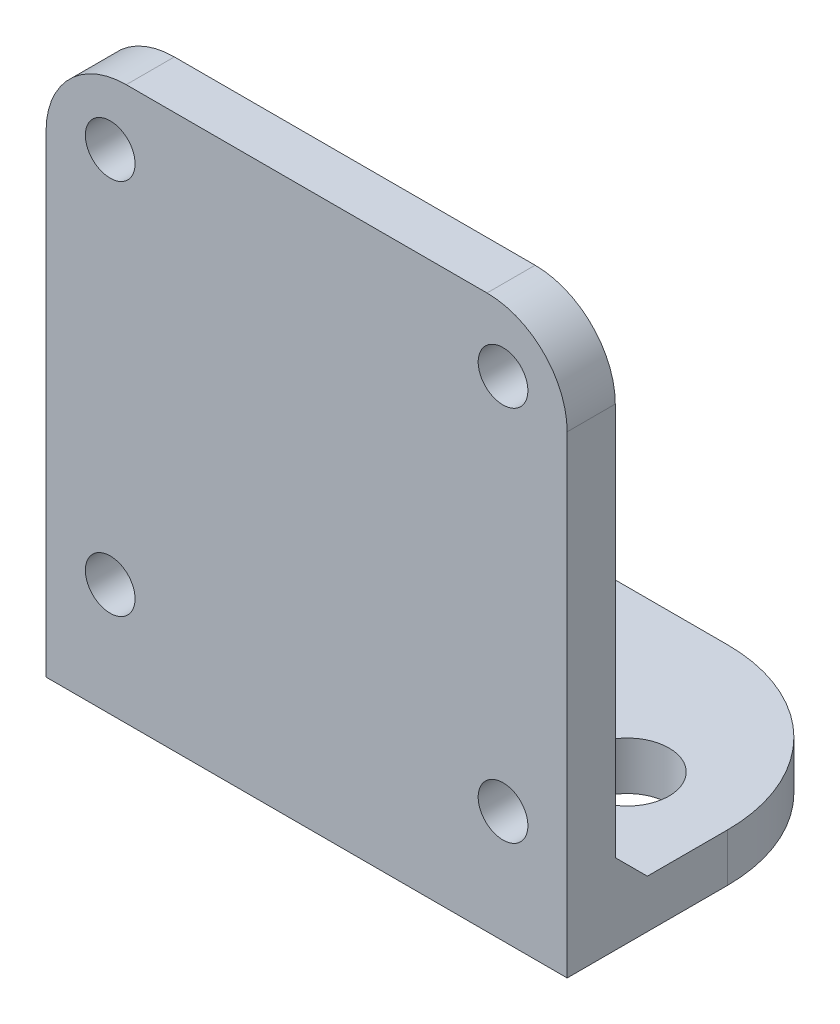
ISO-10303-21;
HEADER;
FILE_DESCRIPTION(('STEP AP214'),'2;1');
FILE_NAME('part.step','',(''),(''),'','','');
FILE_SCHEMA(('AUTOMOTIVE_DESIGN { 1 0 10303 214 1 1 1 1 }'));
ENDSEC;
DATA;
#1=APPLICATION_CONTEXT('core data for automotive mechanical design processes');
#2=APPLICATION_PROTOCOL_DEFINITION('international standard','automotive_design',2000,#1);
#3=PRODUCT_CONTEXT('',#1,'mechanical');
#4=PRODUCT('Part','Part','',(#3));
#5=PRODUCT_RELATED_PRODUCT_CATEGORY('part','',(#4));
#6=PRODUCT_DEFINITION_FORMATION('','',#4);
#7=PRODUCT_DEFINITION_CONTEXT('part definition',#1,'design');
#8=PRODUCT_DEFINITION('design','',#6,#7);
#9=PRODUCT_DEFINITION_SHAPE('','',#8);
#10=(LENGTH_UNIT() NAMED_UNIT(*) SI_UNIT(.MILLI.,.METRE.));
#11=(NAMED_UNIT(*) PLANE_ANGLE_UNIT() SI_UNIT($,.RADIAN.));
#12=(NAMED_UNIT(*) SI_UNIT($,.STERADIAN.) SOLID_ANGLE_UNIT());
#13=UNCERTAINTY_MEASURE_WITH_UNIT(LENGTH_MEASURE(1.E-05),#10,'distance_accuracy_value','');
#14=(GEOMETRIC_REPRESENTATION_CONTEXT(3) GLOBAL_UNCERTAINTY_ASSIGNED_CONTEXT((#13)) GLOBAL_UNIT_ASSIGNED_CONTEXT((#10,
#11,#12)) REPRESENTATION_CONTEXT('',''));
#15=CARTESIAN_POINT('',(0.,0.,0.));
#16=DIRECTION('',(0.,0.,1.));
#17=DIRECTION('',(1.,0.,0.));
#18=AXIS2_PLACEMENT_3D('',#15,#16,#17);
#19=CARTESIAN_POINT('',(0.,0.,3.));
#20=DIRECTION('',(0.,0.,-1.));
#21=DIRECTION('',(-1.,0.,0.));
#22=AXIS2_PLACEMENT_3D('',#19,#20,#21);
#23=PLANE('',#22);
#24=DIRECTION('',(0.,1.,0.));
#25=VECTOR('',#24,1.);
#26=CARTESIAN_POINT('',(28.5,-27.5,3.));
#27=LINE('',#26,#25);
#28=CARTESIAN_POINT('',(28.5,-30.5,3.));
#29=VERTEX_POINT('',#28);
#30=CARTESIAN_POINT('',(28.5,-1.,3.));
#31=VERTEX_POINT('',#30);
#32=EDGE_CURVE('E151',#29,#31,#27,.T.);
#33=ORIENTED_EDGE('',*,*,#32,.T.);
#34=CARTESIAN_POINT('',(23.5,-1.,3.));
#35=DIRECTION('',(0.,0.,-1.));
#36=DIRECTION('',(-1.,0.,0.));
#37=AXIS2_PLACEMENT_3D('',#34,#35,#36);
#38=CIRCLE('',#37,5.);
#39=CARTESIAN_POINT('',(23.5,4.,3.));
#40=VERTEX_POINT('',#39);
#41=EDGE_CURVE('E42',#31,#40,#38,.F.);
#42=ORIENTED_EDGE('',*,*,#41,.T.);
#43=DIRECTION('',(-1.,0.,0.));
#44=VECTOR('',#43,1.);
#45=CARTESIAN_POINT('',(-4.00000000000001,4.,3.));
#46=LINE('',#45,#44);
#47=CARTESIAN_POINT('',(0.999999999999997,4.,3.));
#48=VERTEX_POINT('',#47);
#49=EDGE_CURVE('E125',#40,#48,#46,.T.);
#50=ORIENTED_EDGE('',*,*,#49,.T.);
#51=CARTESIAN_POINT('',(0.999999999999997,-1.,3.));
#52=DIRECTION('',(0.,0.,-1.));
#53=DIRECTION('',(-1.,0.,0.));
#54=AXIS2_PLACEMENT_3D('',#51,#52,#53);
#55=CIRCLE('',#54,5.);
#56=CARTESIAN_POINT('',(-4.00000000000001,-1.,3.));
#57=VERTEX_POINT('',#56);
#58=EDGE_CURVE('E49',#48,#57,#55,.F.);
#59=ORIENTED_EDGE('',*,*,#58,.T.);
#60=DIRECTION('',(0.,-1.,0.));
#61=VECTOR('',#60,1.);
#62=CARTESIAN_POINT('',(-4.00000000000001,4.,3.));
#63=LINE('',#62,#61);
#64=CARTESIAN_POINT('',(-4.,-30.5,3.));
#65=VERTEX_POINT('',#64);
#66=EDGE_CURVE('E117',#57,#65,#63,.T.);
#67=ORIENTED_EDGE('',*,*,#66,.T.);
#68=DIRECTION('',(1.,0.,0.));
#69=VECTOR('',#68,1.);
#70=CARTESIAN_POINT('',(28.5,-30.5,3.));
#71=LINE('',#70,#69);
#72=EDGE_CURVE('E121',#65,#29,#71,.T.);
#73=ORIENTED_EDGE('',*,*,#72,.T.);
#74=EDGE_LOOP('',(#33,#42,#50,#59,#67,#73));
#75=FACE_BOUND('',#74,.T.);
#76=CARTESIAN_POINT('',(0.,0.,3.));
#77=DIRECTION('',(0.,0.,1.));
#78=DIRECTION('',(1.,0.,0.));
#79=AXIS2_PLACEMENT_3D('',#76,#77,#78);
#80=CIRCLE('',#79,1.55);
#81=CARTESIAN_POINT('',(1.55,0.,3.));
#82=VERTEX_POINT('',#81);
#83=EDGE_CURVE('E148',#82,#82,#80,.T.);
#84=ORIENTED_EDGE('',*,*,#83,.F.);
#85=EDGE_LOOP('',(#84));
#86=FACE_BOUND('',#85,.T.);
#87=CARTESIAN_POINT('',(24.5,0.,3.));
#88=DIRECTION('',(0.,0.,1.));
#89=DIRECTION('',(1.,0.,0.));
#90=AXIS2_PLACEMENT_3D('',#87,#88,#89);
#91=CIRCLE('',#90,1.55);
#92=CARTESIAN_POINT('',(26.05,0.,3.));
#93=VERTEX_POINT('',#92);
#94=EDGE_CURVE('E291',#93,#93,#91,.T.);
#95=ORIENTED_EDGE('',*,*,#94,.F.);
#96=EDGE_LOOP('',(#95));
#97=FACE_BOUND('',#96,.T.);
#98=CARTESIAN_POINT('',(0.,-23.5,3.));
#99=DIRECTION('',(0.,0.,1.));
#100=DIRECTION('',(1.,0.,0.));
#101=AXIS2_PLACEMENT_3D('',#98,#99,#100);
#102=CIRCLE('',#101,1.55);
#103=CARTESIAN_POINT('',(1.55,-23.5,3.));
#104=VERTEX_POINT('',#103);
#105=EDGE_CURVE('E285',#104,#104,#102,.T.);
#106=ORIENTED_EDGE('',*,*,#105,.F.);
#107=EDGE_LOOP('',(#106));
#108=FACE_BOUND('',#107,.T.);
#109=CARTESIAN_POINT('',(24.5,-23.5,3.));
#110=DIRECTION('',(0.,0.,1.));
#111=DIRECTION('',(1.,0.,0.));
#112=AXIS2_PLACEMENT_3D('',#109,#110,#111);
#113=CIRCLE('',#112,1.55);
#114=CARTESIAN_POINT('',(26.05,-23.5,3.));
#115=VERTEX_POINT('',#114);
#116=EDGE_CURVE('E279',#115,#115,#113,.T.);
#117=ORIENTED_EDGE('',*,*,#116,.F.);
#118=EDGE_LOOP('',(#117));
#119=FACE_BOUND('',#118,.T.);
#120=ADVANCED_FACE('F34',(#75,#86,#97,#108,#119),#23,.F.);
#121=CARTESIAN_POINT('',(0.,0.,0.));
#122=DIRECTION('',(0.,0.,-1.));
#123=DIRECTION('',(-1.,0.,0.));
#124=AXIS2_PLACEMENT_3D('',#121,#122,#123);
#125=PLANE('',#124);
#126=DIRECTION('',(-1.,0.,0.));
#127=VECTOR('',#126,1.);
#128=CARTESIAN_POINT('',(-4.00000000000001,4.,0.));
#129=LINE('',#128,#127);
#130=CARTESIAN_POINT('',(23.5,4.,0.));
#131=VERTEX_POINT('',#130);
#132=CARTESIAN_POINT('',(0.999999999999997,4.,0.));
#133=VERTEX_POINT('',#132);
#134=EDGE_CURVE('E144',#131,#133,#129,.T.);
#135=ORIENTED_EDGE('',*,*,#134,.F.);
#136=CARTESIAN_POINT('',(23.5,-1.,0.));
#137=DIRECTION('',(0.,0.,-1.));
#138=DIRECTION('',(-1.,0.,0.));
#139=AXIS2_PLACEMENT_3D('',#136,#137,#138);
#140=CIRCLE('',#139,5.);
#141=CARTESIAN_POINT('',(28.5,-1.,0.));
#142=VERTEX_POINT('',#141);
#143=EDGE_CURVE('E196',#131,#142,#140,.T.);
#144=ORIENTED_EDGE('',*,*,#143,.T.);
#145=DIRECTION('',(0.,1.,0.));
#146=VECTOR('',#145,1.);
#147=CARTESIAN_POINT('',(28.5,-27.5,0.));
#148=LINE('',#147,#146);
#149=CARTESIAN_POINT('',(28.5,-25.5,0.));
#150=VERTEX_POINT('',#149);
#151=EDGE_CURVE('E150',#150,#142,#148,.T.);
#152=ORIENTED_EDGE('',*,*,#151,.F.);
#153=DIRECTION('',(-1.,0.,0.));
#154=VECTOR('',#153,1.);
#155=CARTESIAN_POINT('',(0.,-25.5,0.));
#156=LINE('',#155,#154);
#157=CARTESIAN_POINT('',(-4.,-25.5,0.));
#158=VERTEX_POINT('',#157);
#159=EDGE_CURVE('E164',#150,#158,#156,.T.);
#160=ORIENTED_EDGE('',*,*,#159,.T.);
#161=DIRECTION('',(0.,-1.,0.));
#162=VECTOR('',#161,1.);
#163=CARTESIAN_POINT('',(-4.,-30.5,0.));
#164=LINE('',#163,#162);
#165=CARTESIAN_POINT('',(-4.,-1.,0.));
#166=VERTEX_POINT('',#165);
#167=EDGE_CURVE('E147',#166,#158,#164,.T.);
#168=ORIENTED_EDGE('',*,*,#167,.F.);
#169=CARTESIAN_POINT('',(0.999999999999997,-1.,0.));
#170=DIRECTION('',(0.,0.,-1.));
#171=DIRECTION('',(-1.,0.,0.));
#172=AXIS2_PLACEMENT_3D('',#169,#170,#171);
#173=CIRCLE('',#172,5.);
#174=EDGE_CURVE('E194',#166,#133,#173,.T.);
#175=ORIENTED_EDGE('',*,*,#174,.T.);
#176=EDGE_LOOP('',(#135,#144,#152,#160,#168,#175));
#177=FACE_BOUND('',#176,.T.);
#178=CARTESIAN_POINT('',(0.,-23.5,0.));
#179=DIRECTION('',(0.,0.,1.));
#180=DIRECTION('',(1.,0.,0.));
#181=AXIS2_PLACEMENT_3D('',#178,#179,#180);
#182=CIRCLE('',#181,1.55);
#183=CARTESIAN_POINT('',(1.55,-23.5,0.));
#184=VERTEX_POINT('',#183);
#185=EDGE_CURVE('E282',#184,#184,#182,.T.);
#186=ORIENTED_EDGE('',*,*,#185,.T.);
#187=EDGE_LOOP('',(#186));
#188=FACE_BOUND('',#187,.T.);
#189=CARTESIAN_POINT('',(0.,0.,0.));
#190=DIRECTION('',(0.,0.,1.));
#191=DIRECTION('',(1.,0.,0.));
#192=AXIS2_PLACEMENT_3D('',#189,#190,#191);
#193=CIRCLE('',#192,1.55);
#194=CARTESIAN_POINT('',(1.55,0.,0.));
#195=VERTEX_POINT('',#194);
#196=EDGE_CURVE('E294',#195,#195,#193,.T.);
#197=ORIENTED_EDGE('',*,*,#196,.T.);
#198=EDGE_LOOP('',(#197));
#199=FACE_BOUND('',#198,.T.);
#200=CARTESIAN_POINT('',(24.5,0.,0.));
#201=DIRECTION('',(0.,0.,1.));
#202=DIRECTION('',(1.,0.,0.));
#203=AXIS2_PLACEMENT_3D('',#200,#201,#202);
#204=CIRCLE('',#203,1.55);
#205=CARTESIAN_POINT('',(26.05,0.,0.));
#206=VERTEX_POINT('',#205);
#207=EDGE_CURVE('E288',#206,#206,#204,.T.);
#208=ORIENTED_EDGE('',*,*,#207,.T.);
#209=EDGE_LOOP('',(#208));
#210=FACE_BOUND('',#209,.T.);
#211=CARTESIAN_POINT('',(24.5,-23.5,0.));
#212=DIRECTION('',(0.,0.,1.));
#213=DIRECTION('',(1.,0.,0.));
#214=AXIS2_PLACEMENT_3D('',#211,#212,#213);
#215=CIRCLE('',#214,1.55);
#216=CARTESIAN_POINT('',(26.05,-23.5,0.));
#217=VERTEX_POINT('',#216);
#218=EDGE_CURVE('E226',#217,#217,#215,.T.);
#219=ORIENTED_EDGE('',*,*,#218,.T.);
#220=EDGE_LOOP('',(#219));
#221=FACE_BOUND('',#220,.T.);
#222=ADVANCED_FACE('F210',(#177,#188,#199,#210,#221),#125,.T.);
#223=CARTESIAN_POINT('',(-4.00000000000001,4.,3.));
#224=DIRECTION('',(0.,-1.,0.));
#225=DIRECTION('',(0.,0.,-1.));
#226=AXIS2_PLACEMENT_3D('',#223,#224,#225);
#227=PLANE('',#226);
#228=ORIENTED_EDGE('',*,*,#49,.F.);
#229=DIRECTION('',(0.,0.,-1.));
#230=VECTOR('',#229,1.);
#231=CARTESIAN_POINT('',(23.5,4.,3.));
#232=LINE('',#231,#230);
#233=EDGE_CURVE('E191',#40,#131,#232,.T.);
#234=ORIENTED_EDGE('',*,*,#233,.T.);
#235=ORIENTED_EDGE('',*,*,#134,.T.);
#236=DIRECTION('',(0.,0.,-1.));
#237=VECTOR('',#236,1.);
#238=CARTESIAN_POINT('',(0.999999999999997,4.,3.));
#239=LINE('',#238,#237);
#240=EDGE_CURVE('E189',#133,#48,#239,.F.);
#241=ORIENTED_EDGE('',*,*,#240,.T.);
#242=EDGE_LOOP('',(#228,#234,#235,#241));
#243=FACE_BOUND('',#242,.T.);
#244=ADVANCED_FACE('F204',(#243),#227,.F.);
#245=CARTESIAN_POINT('',(-4.,-30.5,3.));
#246=DIRECTION('',(1.,0.,0.));
#247=DIRECTION('',(0.,0.,-1.));
#248=AXIS2_PLACEMENT_3D('',#245,#246,#247);
#249=PLANE('',#248);
#250=ORIENTED_EDGE('',*,*,#66,.F.);
#251=DIRECTION('',(0.,0.,-1.));
#252=VECTOR('',#251,1.);
#253=CARTESIAN_POINT('',(-4.,-1.,3.));
#254=LINE('',#253,#252);
#255=EDGE_CURVE('E11',#57,#166,#254,.T.);
#256=ORIENTED_EDGE('',*,*,#255,.T.);
#257=ORIENTED_EDGE('',*,*,#167,.T.);
#258=DIRECTION('',(0.,-0.707106781186543,-0.707106781186552));
#259=VECTOR('',#258,1.);
#260=CARTESIAN_POINT('',(-4.,-26.5,-0.999999999999977));
#261=LINE('',#260,#259);
#262=CARTESIAN_POINT('',(-4.00000000000001,-27.5,-2.00000000000002));
#263=VERTEX_POINT('',#262);
#264=EDGE_CURVE('E169',#158,#263,#261,.T.);
#265=ORIENTED_EDGE('',*,*,#264,.T.);
#266=DIRECTION('',(0.,0.,1.));
#267=VECTOR('',#266,1.);
#268=CARTESIAN_POINT('',(-4.00000000000001,-27.5,-17.));
#269=LINE('',#268,#267);
#270=CARTESIAN_POINT('',(-4.00000000000001,-27.5,-7.));
#271=VERTEX_POINT('',#270);
#272=EDGE_CURVE('E225',#271,#263,#269,.T.);
#273=ORIENTED_EDGE('',*,*,#272,.F.);
#274=DIRECTION('',(0.,1.,0.));
#275=VECTOR('',#274,1.);
#276=CARTESIAN_POINT('',(-4.,-30.5,-7.));
#277=LINE('',#276,#275);
#278=CARTESIAN_POINT('',(-4.,-30.5,-7.));
#279=VERTEX_POINT('',#278);
#280=EDGE_CURVE('E132',#271,#279,#277,.F.);
#281=ORIENTED_EDGE('',*,*,#280,.T.);
#282=DIRECTION('',(0.,0.,-1.));
#283=VECTOR('',#282,1.);
#284=CARTESIAN_POINT('',(-4.,-30.5,3.));
#285=LINE('',#284,#283);
#286=EDGE_CURVE('E128',#65,#279,#285,.T.);
#287=ORIENTED_EDGE('',*,*,#286,.F.);
#288=EDGE_LOOP('',(#250,#256,#257,#265,#273,#281,#287));
#289=FACE_BOUND('',#288,.T.);
#290=ADVANCED_FACE('F129',(#289),#249,.F.);
#291=CARTESIAN_POINT('',(28.5,-30.5,3.));
#292=DIRECTION('',(0.,1.,0.));
#293=DIRECTION('',(0.,0.,1.));
#294=AXIS2_PLACEMENT_3D('',#291,#292,#293);
#295=PLANE('',#294);
#296=CARTESIAN_POINT('',(2.25,-30.5,-7.));
#297=DIRECTION('',(0.,-1.,0.));
#298=DIRECTION('',(0.,0.,-1.));
#299=AXIS2_PLACEMENT_3D('',#296,#297,#298);
#300=CIRCLE('',#299,2.6);
#301=CARTESIAN_POINT('',(2.25,-30.5,-9.6));
#302=VERTEX_POINT('',#301);
#303=EDGE_CURVE('E161',#302,#302,#300,.T.);
#304=ORIENTED_EDGE('',*,*,#303,.F.);
#305=EDGE_LOOP('',(#304));
#306=FACE_BOUND('',#305,.T.);
#307=CARTESIAN_POINT('',(22.25,-30.5,-7.));
#308=DIRECTION('',(0.,-1.,0.));
#309=DIRECTION('',(0.,0.,-1.));
#310=AXIS2_PLACEMENT_3D('',#307,#308,#309);
#311=CIRCLE('',#310,2.6);
#312=CARTESIAN_POINT('',(22.25,-30.5,-9.6));
#313=VERTEX_POINT('',#312);
#314=EDGE_CURVE('E157',#313,#313,#311,.T.);
#315=ORIENTED_EDGE('',*,*,#314,.F.);
#316=EDGE_LOOP('',(#315));
#317=FACE_BOUND('',#316,.T.);
#318=ORIENTED_EDGE('',*,*,#286,.T.);
#319=CARTESIAN_POINT('',(6.,-30.5,-7.));
#320=DIRECTION('',(0.,1.,0.));
#321=DIRECTION('',(0.,0.,1.));
#322=AXIS2_PLACEMENT_3D('',#319,#320,#321);
#323=CIRCLE('',#322,10.);
#324=CARTESIAN_POINT('',(6.,-30.5,-17.));
#325=VERTEX_POINT('',#324);
#326=EDGE_CURVE('E185',#279,#325,#323,.F.);
#327=ORIENTED_EDGE('',*,*,#326,.T.);
#328=DIRECTION('',(-1.,0.,0.));
#329=VECTOR('',#328,1.);
#330=CARTESIAN_POINT('',(28.5,-30.5,-17.));
#331=LINE('',#330,#329);
#332=CARTESIAN_POINT('',(18.5,-30.5,-17.));
#333=VERTEX_POINT('',#332);
#334=EDGE_CURVE('E156',#333,#325,#331,.T.);
#335=ORIENTED_EDGE('',*,*,#334,.F.);
#336=CARTESIAN_POINT('',(18.5,-30.5,-7.));
#337=DIRECTION('',(0.,1.,0.));
#338=DIRECTION('',(0.,0.,1.));
#339=AXIS2_PLACEMENT_3D('',#336,#337,#338);
#340=CIRCLE('',#339,10.);
#341=CARTESIAN_POINT('',(28.5,-30.5,-7.));
#342=VERTEX_POINT('',#341);
#343=EDGE_CURVE('E183',#333,#342,#340,.F.);
#344=ORIENTED_EDGE('',*,*,#343,.T.);
#345=DIRECTION('',(0.,0.,-1.));
#346=VECTOR('',#345,1.);
#347=CARTESIAN_POINT('',(28.5,-30.5,3.));
#348=LINE('',#347,#346);
#349=EDGE_CURVE('E136',#29,#342,#348,.T.);
#350=ORIENTED_EDGE('',*,*,#349,.F.);
#351=ORIENTED_EDGE('',*,*,#72,.F.);
#352=EDGE_LOOP('',(#318,#327,#335,#344,#350,#351));
#353=FACE_BOUND('',#352,.T.);
#354=ADVANCED_FACE('F138',(#306,#317,#353),#295,.F.);
#355=CARTESIAN_POINT('',(28.5,-27.5,3.));
#356=DIRECTION('',(-1.,0.,0.));
#357=DIRECTION('',(0.,0.,1.));
#358=AXIS2_PLACEMENT_3D('',#355,#356,#357);
#359=PLANE('',#358);
#360=ORIENTED_EDGE('',*,*,#151,.T.);
#361=DIRECTION('',(0.,0.,-1.));
#362=VECTOR('',#361,1.);
#363=CARTESIAN_POINT('',(28.5,-1.,3.));
#364=LINE('',#363,#362);
#365=EDGE_CURVE('E57',#142,#31,#364,.F.);
#366=ORIENTED_EDGE('',*,*,#365,.T.);
#367=ORIENTED_EDGE('',*,*,#32,.F.);
#368=ORIENTED_EDGE('',*,*,#349,.T.);
#369=DIRECTION('',(0.,-1.,0.));
#370=VECTOR('',#369,1.);
#371=CARTESIAN_POINT('',(28.5,-27.5,-7.));
#372=LINE('',#371,#370);
#373=CARTESIAN_POINT('',(28.5,-27.5,-7.));
#374=VERTEX_POINT('',#373);
#375=EDGE_CURVE('E187',#342,#374,#372,.F.);
#376=ORIENTED_EDGE('',*,*,#375,.T.);
#377=DIRECTION('',(0.,0.,1.));
#378=VECTOR('',#377,1.);
#379=CARTESIAN_POINT('',(28.5,-27.5,-17.));
#380=LINE('',#379,#378);
#381=CARTESIAN_POINT('',(28.5,-27.5,-2.00000000000002));
#382=VERTEX_POINT('',#381);
#383=EDGE_CURVE('E216',#374,#382,#380,.T.);
#384=ORIENTED_EDGE('',*,*,#383,.T.);
#385=DIRECTION('',(0.,0.707106781186543,0.707106781186552));
#386=VECTOR('',#385,1.);
#387=CARTESIAN_POINT('',(28.5,-25.,0.500000000000023));
#388=LINE('',#387,#386);
#389=EDGE_CURVE('E167',#382,#150,#388,.T.);
#390=ORIENTED_EDGE('',*,*,#389,.T.);
#391=EDGE_LOOP('',(#360,#366,#367,#368,#376,#384,#390));
#392=FACE_BOUND('',#391,.T.);
#393=ADVANCED_FACE('F213',(#392),#359,.F.);
#394=CARTESIAN_POINT('',(0.,0.,3.));
#395=DIRECTION('',(0.,0.,-1.));
#396=DIRECTION('',(-1.,0.,0.));
#397=AXIS2_PLACEMENT_3D('',#394,#395,#396);
#398=CYLINDRICAL_SURFACE('',#397,1.55);
#399=ORIENTED_EDGE('',*,*,#83,.T.);
#400=EDGE_LOOP('',(#399));
#401=FACE_BOUND('',#400,.T.);
#402=ORIENTED_EDGE('',*,*,#196,.F.);
#403=EDGE_LOOP('',(#402));
#404=FACE_BOUND('',#403,.T.);
#405=ADVANCED_FACE('F242',(#401,#404),#398,.F.);
#406=CARTESIAN_POINT('',(24.5,0.,3.));
#407=DIRECTION('',(0.,0.,-1.));
#408=DIRECTION('',(-1.,0.,0.));
#409=AXIS2_PLACEMENT_3D('',#406,#407,#408);
#410=CYLINDRICAL_SURFACE('',#409,1.55);
#411=ORIENTED_EDGE('',*,*,#94,.T.);
#412=EDGE_LOOP('',(#411));
#413=FACE_BOUND('',#412,.T.);
#414=ORIENTED_EDGE('',*,*,#207,.F.);
#415=EDGE_LOOP('',(#414));
#416=FACE_BOUND('',#415,.T.);
#417=ADVANCED_FACE('F306',(#413,#416),#410,.F.);
#418=CARTESIAN_POINT('',(0.,-23.5,3.));
#419=DIRECTION('',(0.,0.,-1.));
#420=DIRECTION('',(-1.,0.,0.));
#421=AXIS2_PLACEMENT_3D('',#418,#419,#420);
#422=CYLINDRICAL_SURFACE('',#421,1.55);
#423=ORIENTED_EDGE('',*,*,#105,.T.);
#424=EDGE_LOOP('',(#423));
#425=FACE_BOUND('',#424,.T.);
#426=ORIENTED_EDGE('',*,*,#185,.F.);
#427=EDGE_LOOP('',(#426));
#428=FACE_BOUND('',#427,.T.);
#429=ADVANCED_FACE('F311',(#425,#428),#422,.F.);
#430=CARTESIAN_POINT('',(24.5,-23.5,3.));
#431=DIRECTION('',(0.,0.,-1.));
#432=DIRECTION('',(-1.,0.,0.));
#433=AXIS2_PLACEMENT_3D('',#430,#431,#432);
#434=CYLINDRICAL_SURFACE('',#433,1.55);
#435=ORIENTED_EDGE('',*,*,#116,.T.);
#436=EDGE_LOOP('',(#435));
#437=FACE_BOUND('',#436,.T.);
#438=ORIENTED_EDGE('',*,*,#218,.F.);
#439=EDGE_LOOP('',(#438));
#440=FACE_BOUND('',#439,.T.);
#441=ADVANCED_FACE('F321',(#437,#440),#434,.F.);
#442=CARTESIAN_POINT('',(28.5,-27.5,-17.));
#443=DIRECTION('',(0.,-1.,0.));
#444=DIRECTION('',(0.,0.,-1.));
#445=AXIS2_PLACEMENT_3D('',#442,#443,#444);
#446=PLANE('',#445);
#447=CARTESIAN_POINT('',(2.25,-27.5,-7.));
#448=DIRECTION('',(0.,-1.,0.));
#449=DIRECTION('',(0.,0.,-1.));
#450=AXIS2_PLACEMENT_3D('',#447,#448,#449);
#451=CIRCLE('',#450,2.6);
#452=CARTESIAN_POINT('',(2.25,-27.5,-9.6));
#453=VERTEX_POINT('',#452);
#454=EDGE_CURVE('E158',#453,#453,#451,.T.);
#455=ORIENTED_EDGE('',*,*,#454,.T.);
#456=EDGE_LOOP('',(#455));
#457=FACE_BOUND('',#456,.T.);
#458=CARTESIAN_POINT('',(22.25,-27.5,-7.));
#459=DIRECTION('',(0.,-1.,0.));
#460=DIRECTION('',(0.,0.,-1.));
#461=AXIS2_PLACEMENT_3D('',#458,#459,#460);
#462=CIRCLE('',#461,2.6);
#463=CARTESIAN_POINT('',(22.25,-27.5,-9.6));
#464=VERTEX_POINT('',#463);
#465=EDGE_CURVE('E153',#464,#464,#462,.T.);
#466=ORIENTED_EDGE('',*,*,#465,.T.);
#467=EDGE_LOOP('',(#466));
#468=FACE_BOUND('',#467,.T.);
#469=DIRECTION('',(1.,0.,0.));
#470=VECTOR('',#469,1.);
#471=CARTESIAN_POINT('',(28.5,-27.5,-17.));
#472=LINE('',#471,#470);
#473=CARTESIAN_POINT('',(6.,-27.5,-17.));
#474=VERTEX_POINT('',#473);
#475=CARTESIAN_POINT('',(18.5,-27.5,-17.));
#476=VERTEX_POINT('',#475);
#477=EDGE_CURVE('E268',#474,#476,#472,.T.);
#478=ORIENTED_EDGE('',*,*,#477,.F.);
#479=CARTESIAN_POINT('',(6.,-27.5,-7.));
#480=DIRECTION('',(0.,-1.,0.));
#481=DIRECTION('',(0.,0.,-1.));
#482=AXIS2_PLACEMENT_3D('',#479,#480,#481);
#483=CIRCLE('',#482,10.);
#484=EDGE_CURVE('E180',#474,#271,#483,.F.);
#485=ORIENTED_EDGE('',*,*,#484,.T.);
#486=ORIENTED_EDGE('',*,*,#272,.T.);
#487=DIRECTION('',(1.,0.,0.));
#488=VECTOR('',#487,1.);
#489=CARTESIAN_POINT('',(28.5,-27.5,-2.00000000000002));
#490=LINE('',#489,#488);
#491=EDGE_CURVE('E135',#263,#382,#490,.T.);
#492=ORIENTED_EDGE('',*,*,#491,.T.);
#493=ORIENTED_EDGE('',*,*,#383,.F.);
#494=CARTESIAN_POINT('',(18.5,-27.5,-7.));
#495=DIRECTION('',(0.,-1.,0.));
#496=DIRECTION('',(0.,0.,-1.));
#497=AXIS2_PLACEMENT_3D('',#494,#495,#496);
#498=CIRCLE('',#497,10.);
#499=EDGE_CURVE('E178',#374,#476,#498,.F.);
#500=ORIENTED_EDGE('',*,*,#499,.T.);
#501=EDGE_LOOP('',(#478,#485,#486,#492,#493,#500));
#502=FACE_BOUND('',#501,.T.);
#503=ADVANCED_FACE('F223',(#457,#468,#502),#446,.F.);
#504=CARTESIAN_POINT('',(0.,0.,-17.));
#505=DIRECTION('',(0.,0.,1.));
#506=DIRECTION('',(1.,0.,0.));
#507=AXIS2_PLACEMENT_3D('',#504,#505,#506);
#508=PLANE('',#507);
#509=ORIENTED_EDGE('',*,*,#334,.T.);
#510=DIRECTION('',(0.,1.,0.));
#511=VECTOR('',#510,1.);
#512=CARTESIAN_POINT('',(6.,0.,-17.));
#513=LINE('',#512,#511);
#514=EDGE_CURVE('E175',#325,#474,#513,.T.);
#515=ORIENTED_EDGE('',*,*,#514,.T.);
#516=ORIENTED_EDGE('',*,*,#477,.T.);
#517=DIRECTION('',(0.,-1.,0.));
#518=VECTOR('',#517,1.);
#519=CARTESIAN_POINT('',(18.5,0.,-17.));
#520=LINE('',#519,#518);
#521=EDGE_CURVE('E172',#476,#333,#520,.T.);
#522=ORIENTED_EDGE('',*,*,#521,.T.);
#523=EDGE_LOOP('',(#509,#515,#516,#522));
#524=FACE_BOUND('',#523,.T.);
#525=ADVANCED_FACE('F271',(#524),#508,.F.);
#526=CARTESIAN_POINT('',(22.25,-13.5,-7.));
#527=DIRECTION('',(0.,-1.,0.));
#528=DIRECTION('',(0.,0.,-1.));
#529=AXIS2_PLACEMENT_3D('',#526,#527,#528);
#530=CYLINDRICAL_SURFACE('',#529,2.6);
#531=ORIENTED_EDGE('',*,*,#314,.T.);
#532=EDGE_LOOP('',(#531));
#533=FACE_BOUND('',#532,.T.);
#534=ORIENTED_EDGE('',*,*,#465,.F.);
#535=EDGE_LOOP('',(#534));
#536=FACE_BOUND('',#535,.T.);
#537=ADVANCED_FACE('F338',(#533,#536),#530,.F.);
#538=CARTESIAN_POINT('',(2.25,-13.5,-7.));
#539=DIRECTION('',(0.,-1.,0.));
#540=DIRECTION('',(0.,0.,-1.));
#541=AXIS2_PLACEMENT_3D('',#538,#539,#540);
#542=CYLINDRICAL_SURFACE('',#541,2.6);
#543=ORIENTED_EDGE('',*,*,#303,.T.);
#544=EDGE_LOOP('',(#543));
#545=FACE_BOUND('',#544,.T.);
#546=ORIENTED_EDGE('',*,*,#454,.F.);
#547=EDGE_LOOP('',(#546));
#548=FACE_BOUND('',#547,.T.);
#549=ADVANCED_FACE('F257',(#545,#548),#542,.F.);
#550=CARTESIAN_POINT('',(28.5,-27.5,-2.00000000000002));
#551=DIRECTION('',(0.,-0.707106781186552,0.707106781186543));
#552=DIRECTION('',(1.,0.,0.));
#553=AXIS2_PLACEMENT_3D('',#550,#551,#552);
#554=PLANE('',#553);
#555=ORIENTED_EDGE('',*,*,#264,.F.);
#556=ORIENTED_EDGE('',*,*,#159,.F.);
#557=ORIENTED_EDGE('',*,*,#389,.F.);
#558=ORIENTED_EDGE('',*,*,#491,.F.);
#559=EDGE_LOOP('',(#555,#556,#557,#558));
#560=FACE_BOUND('',#559,.T.);
#561=ADVANCED_FACE('F220',(#560),#554,.F.);
#562=CARTESIAN_POINT('',(6.,0.,-7.));
#563=DIRECTION('',(0.,1.,0.));
#564=DIRECTION('',(0.,0.,1.));
#565=AXIS2_PLACEMENT_3D('',#562,#563,#564);
#566=CYLINDRICAL_SURFACE('',#565,10.);
#567=ORIENTED_EDGE('',*,*,#326,.F.);
#568=ORIENTED_EDGE('',*,*,#280,.F.);
#569=ORIENTED_EDGE('',*,*,#484,.F.);
#570=ORIENTED_EDGE('',*,*,#514,.F.);
#571=EDGE_LOOP('',(#567,#568,#569,#570));
#572=FACE_BOUND('',#571,.T.);
#573=ADVANCED_FACE('F256',(#572),#566,.T.);
#574=CARTESIAN_POINT('',(18.5,0.,-7.));
#575=DIRECTION('',(0.,-1.,0.));
#576=DIRECTION('',(0.,0.,-1.));
#577=AXIS2_PLACEMENT_3D('',#574,#575,#576);
#578=CYLINDRICAL_SURFACE('',#577,10.);
#579=ORIENTED_EDGE('',*,*,#499,.F.);
#580=ORIENTED_EDGE('',*,*,#375,.F.);
#581=ORIENTED_EDGE('',*,*,#343,.F.);
#582=ORIENTED_EDGE('',*,*,#521,.F.);
#583=EDGE_LOOP('',(#579,#580,#581,#582));
#584=FACE_BOUND('',#583,.T.);
#585=ADVANCED_FACE('F234',(#584),#578,.T.);
#586=CARTESIAN_POINT('',(23.5,-1.,3.));
#587=DIRECTION('',(0.,0.,-1.));
#588=DIRECTION('',(-1.,0.,0.));
#589=AXIS2_PLACEMENT_3D('',#586,#587,#588);
#590=CYLINDRICAL_SURFACE('',#589,5.);
#591=ORIENTED_EDGE('',*,*,#41,.F.);
#592=ORIENTED_EDGE('',*,*,#365,.F.);
#593=ORIENTED_EDGE('',*,*,#143,.F.);
#594=ORIENTED_EDGE('',*,*,#233,.F.);
#595=EDGE_LOOP('',(#591,#592,#593,#594));
#596=FACE_BOUND('',#595,.T.);
#597=ADVANCED_FACE('F207',(#596),#590,.T.);
#598=CARTESIAN_POINT('',(0.999999999999997,-1.,3.));
#599=DIRECTION('',(0.,0.,-1.));
#600=DIRECTION('',(-1.,0.,0.));
#601=AXIS2_PLACEMENT_3D('',#598,#599,#600);
#602=CYLINDRICAL_SURFACE('',#601,5.);
#603=ORIENTED_EDGE('',*,*,#58,.F.);
#604=ORIENTED_EDGE('',*,*,#240,.F.);
#605=ORIENTED_EDGE('',*,*,#174,.F.);
#606=ORIENTED_EDGE('',*,*,#255,.F.);
#607=EDGE_LOOP('',(#603,#604,#605,#606));
#608=FACE_BOUND('',#607,.T.);
#609=ADVANCED_FACE('F36',(#608),#602,.T.);
#610=CLOSED_SHELL('',(#120,#222,#244,#290,#354,#393,#405,#417,#429,#441,#503,#525,#537,#549,
#561,#573,#585,#597,#609));
#611=MANIFOLD_SOLID_BREP('B2',#610);
#612=ADVANCED_BREP_SHAPE_REPRESENTATION('',(#18,#611),#14);
#613=SHAPE_DEFINITION_REPRESENTATION(#9,#612);
ENDSEC;
END-ISO-10303-21;
